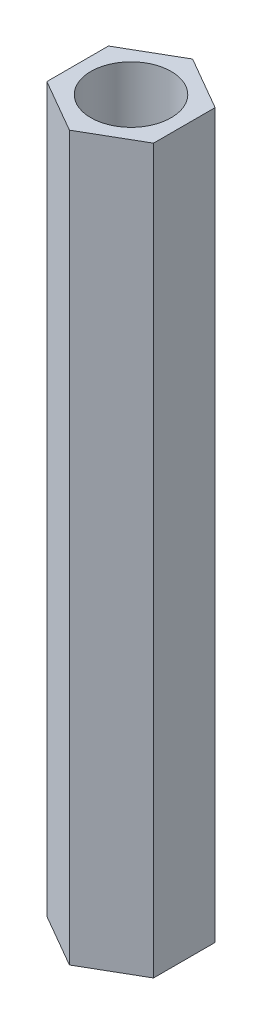
ISO-10303-21;
HEADER;
FILE_DESCRIPTION(('STEP AP214'),'2;1');
FILE_NAME('part.step','',(''),(''),'','','');
FILE_SCHEMA(('AUTOMOTIVE_DESIGN { 1 0 10303 214 1 1 1 1 }'));
ENDSEC;
DATA;
#1=APPLICATION_CONTEXT('core data for automotive mechanical design processes');
#2=APPLICATION_PROTOCOL_DEFINITION('international standard','automotive_design',2000,#1);
#3=PRODUCT_CONTEXT('',#1,'mechanical');
#4=PRODUCT('Part','Part','',(#3));
#5=PRODUCT_RELATED_PRODUCT_CATEGORY('part','',(#4));
#6=PRODUCT_DEFINITION_FORMATION('','',#4);
#7=PRODUCT_DEFINITION_CONTEXT('part definition',#1,'design');
#8=PRODUCT_DEFINITION('design','',#6,#7);
#9=PRODUCT_DEFINITION_SHAPE('','',#8);
#10=(LENGTH_UNIT() NAMED_UNIT(*) SI_UNIT(.MILLI.,.METRE.));
#11=(NAMED_UNIT(*) PLANE_ANGLE_UNIT() SI_UNIT($,.RADIAN.));
#12=(NAMED_UNIT(*) SI_UNIT($,.STERADIAN.) SOLID_ANGLE_UNIT());
#13=UNCERTAINTY_MEASURE_WITH_UNIT(LENGTH_MEASURE(1.E-05),#10,'distance_accuracy_value','');
#14=(GEOMETRIC_REPRESENTATION_CONTEXT(3) GLOBAL_UNCERTAINTY_ASSIGNED_CONTEXT((#13)) GLOBAL_UNIT_ASSIGNED_CONTEXT((#10,
#11,#12)) REPRESENTATION_CONTEXT('',''));
#15=CARTESIAN_POINT('',(0.,0.,0.));
#16=DIRECTION('',(0.,0.,1.));
#17=DIRECTION('',(1.,0.,0.));
#18=AXIS2_PLACEMENT_3D('',#15,#16,#17);
#19=CARTESIAN_POINT('',(0.,27.,0.));
#20=DIRECTION('',(0.,1.,0.));
#21=DIRECTION('',(0.,0.,1.));
#22=AXIS2_PLACEMENT_3D('',#19,#20,#21);
#23=PLANE('',#22);
#24=DIRECTION('',(-0.866025403784439,0.,-0.5));
#25=VECTOR('',#24,1.);
#26=CARTESIAN_POINT('',(1.99185842870421,27.,-1.15));
#27=LINE('',#26,#25);
#28=CARTESIAN_POINT('',(1.99185842870421,27.,-1.15));
#29=VERTEX_POINT('',#28);
#30=CARTESIAN_POINT('',(0.,27.,-2.3));
#31=VERTEX_POINT('',#30);
#32=EDGE_CURVE('E150',#29,#31,#27,.T.);
#33=ORIENTED_EDGE('',*,*,#32,.T.);
#34=DIRECTION('',(-0.866025403784439,0.,0.5));
#35=VECTOR('',#34,1.);
#36=CARTESIAN_POINT('',(0.,27.,-2.3));
#37=LINE('',#36,#35);
#38=CARTESIAN_POINT('',(-1.99185842870421,27.,-1.15));
#39=VERTEX_POINT('',#38);
#40=EDGE_CURVE('E98',#31,#39,#37,.T.);
#41=ORIENTED_EDGE('',*,*,#40,.T.);
#42=DIRECTION('',(0.,0.,1.));
#43=VECTOR('',#42,1.);
#44=CARTESIAN_POINT('',(-1.99185842870421,27.,-1.15));
#45=LINE('',#44,#43);
#46=CARTESIAN_POINT('',(-1.99185842870421,27.,1.15));
#47=VERTEX_POINT('',#46);
#48=EDGE_CURVE('E111',#39,#47,#45,.T.);
#49=ORIENTED_EDGE('',*,*,#48,.T.);
#50=DIRECTION('',(0.866025403784439,0.,0.5));
#51=VECTOR('',#50,1.);
#52=CARTESIAN_POINT('',(-1.99185842870421,27.,1.15));
#53=LINE('',#52,#51);
#54=CARTESIAN_POINT('',(0.,27.,2.3));
#55=VERTEX_POINT('',#54);
#56=EDGE_CURVE('E105',#47,#55,#53,.T.);
#57=ORIENTED_EDGE('',*,*,#56,.T.);
#58=DIRECTION('',(0.866025403784439,0.,-0.5));
#59=VECTOR('',#58,1.);
#60=CARTESIAN_POINT('',(0.,27.,2.3));
#61=LINE('',#60,#59);
#62=CARTESIAN_POINT('',(1.99185842870421,27.,1.15));
#63=VERTEX_POINT('',#62);
#64=EDGE_CURVE('E109',#55,#63,#61,.T.);
#65=ORIENTED_EDGE('',*,*,#64,.T.);
#66=DIRECTION('',(0.,0.,-1.));
#67=VECTOR('',#66,1.);
#68=CARTESIAN_POINT('',(1.99185842870421,27.,1.15));
#69=LINE('',#68,#67);
#70=EDGE_CURVE('E61',#63,#29,#69,.T.);
#71=ORIENTED_EDGE('',*,*,#70,.T.);
#72=EDGE_LOOP('',(#33,#41,#49,#57,#65,#71));
#73=FACE_BOUND('',#72,.T.);
#74=CARTESIAN_POINT('',(0.,27.,0.));
#75=DIRECTION('',(0.,1.,0.));
#76=DIRECTION('',(0.,0.,1.));
#77=AXIS2_PLACEMENT_3D('',#74,#75,#76);
#78=CIRCLE('',#77,1.5);
#79=CARTESIAN_POINT('',(0.,27.,1.5));
#80=VERTEX_POINT('',#79);
#81=EDGE_CURVE('E138',#80,#80,#78,.T.);
#82=ORIENTED_EDGE('',*,*,#81,.F.);
#83=EDGE_LOOP('',(#82));
#84=FACE_BOUND('',#83,.T.);
#85=ADVANCED_FACE('F43',(#73,#84),#23,.T.);
#86=CARTESIAN_POINT('',(0.,0.,0.));
#87=DIRECTION('',(0.,1.,0.));
#88=DIRECTION('',(0.,0.,1.));
#89=AXIS2_PLACEMENT_3D('',#86,#87,#88);
#90=PLANE('',#89);
#91=DIRECTION('',(-0.866025403784439,0.,-0.5));
#92=VECTOR('',#91,1.);
#93=CARTESIAN_POINT('',(1.99185842870421,0.,-1.15));
#94=LINE('',#93,#92);
#95=CARTESIAN_POINT('',(1.99185842870421,0.,-1.15));
#96=VERTEX_POINT('',#95);
#97=CARTESIAN_POINT('',(0.,0.,-2.3));
#98=VERTEX_POINT('',#97);
#99=EDGE_CURVE('E133',#96,#98,#94,.T.);
#100=ORIENTED_EDGE('',*,*,#99,.F.);
#101=DIRECTION('',(0.,0.,-1.));
#102=VECTOR('',#101,1.);
#103=CARTESIAN_POINT('',(1.99185842870421,0.,1.15));
#104=LINE('',#103,#102);
#105=CARTESIAN_POINT('',(1.99185842870421,0.,1.15));
#106=VERTEX_POINT('',#105);
#107=EDGE_CURVE('E90',#106,#96,#104,.T.);
#108=ORIENTED_EDGE('',*,*,#107,.F.);
#109=DIRECTION('',(0.866025403784439,0.,-0.5));
#110=VECTOR('',#109,1.);
#111=CARTESIAN_POINT('',(0.,0.,2.3));
#112=LINE('',#111,#110);
#113=CARTESIAN_POINT('',(0.,0.,2.3));
#114=VERTEX_POINT('',#113);
#115=EDGE_CURVE('E84',#114,#106,#112,.T.);
#116=ORIENTED_EDGE('',*,*,#115,.F.);
#117=DIRECTION('',(0.866025403784439,0.,0.5));
#118=VECTOR('',#117,1.);
#119=CARTESIAN_POINT('',(-1.99185842870421,0.,1.15));
#120=LINE('',#119,#118);
#121=CARTESIAN_POINT('',(-1.99185842870421,0.,1.15));
#122=VERTEX_POINT('',#121);
#123=EDGE_CURVE('E120',#122,#114,#120,.T.);
#124=ORIENTED_EDGE('',*,*,#123,.F.);
#125=DIRECTION('',(0.,0.,1.));
#126=VECTOR('',#125,1.);
#127=CARTESIAN_POINT('',(-1.99185842870421,0.,-1.15));
#128=LINE('',#127,#126);
#129=CARTESIAN_POINT('',(-1.99185842870421,0.,-1.15));
#130=VERTEX_POINT('',#129);
#131=EDGE_CURVE('E141',#130,#122,#128,.T.);
#132=ORIENTED_EDGE('',*,*,#131,.F.);
#133=DIRECTION('',(-0.866025403784439,0.,0.5));
#134=VECTOR('',#133,1.);
#135=CARTESIAN_POINT('',(0.,0.,-2.3));
#136=LINE('',#135,#134);
#137=EDGE_CURVE('E137',#98,#130,#136,.T.);
#138=ORIENTED_EDGE('',*,*,#137,.F.);
#139=EDGE_LOOP('',(#100,#108,#116,#124,#132,#138));
#140=FACE_BOUND('',#139,.T.);
#141=CARTESIAN_POINT('',(0.,0.,0.));
#142=DIRECTION('',(0.,1.,0.));
#143=DIRECTION('',(0.,0.,1.));
#144=AXIS2_PLACEMENT_3D('',#141,#142,#143);
#145=CIRCLE('',#144,1.5);
#146=CARTESIAN_POINT('',(0.,0.,1.5));
#147=VERTEX_POINT('',#146);
#148=EDGE_CURVE('E265',#147,#147,#145,.T.);
#149=ORIENTED_EDGE('',*,*,#148,.T.);
#150=EDGE_LOOP('',(#149));
#151=FACE_BOUND('',#150,.T.);
#152=ADVANCED_FACE('F163',(#140,#151),#90,.F.);
#153=CARTESIAN_POINT('',(1.99185842870421,27.,-1.15));
#154=DIRECTION('',(-0.5,0.,0.866025403784439));
#155=DIRECTION('',(0.866025403784439,0.,0.5));
#156=AXIS2_PLACEMENT_3D('',#153,#154,#155);
#157=PLANE('',#156);
#158=ORIENTED_EDGE('',*,*,#99,.T.);
#159=DIRECTION('',(0.,-1.,0.));
#160=VECTOR('',#159,1.);
#161=CARTESIAN_POINT('',(0.,27.,-2.3));
#162=LINE('',#161,#160);
#163=EDGE_CURVE('E11',#31,#98,#162,.T.);
#164=ORIENTED_EDGE('',*,*,#163,.F.);
#165=ORIENTED_EDGE('',*,*,#32,.F.);
#166=DIRECTION('',(0.,-1.,0.));
#167=VECTOR('',#166,1.);
#168=CARTESIAN_POINT('',(1.99185842870421,27.,-1.15));
#169=LINE('',#168,#167);
#170=EDGE_CURVE('E129',#29,#96,#169,.T.);
#171=ORIENTED_EDGE('',*,*,#170,.T.);
#172=EDGE_LOOP('',(#158,#164,#165,#171));
#173=FACE_BOUND('',#172,.T.);
#174=ADVANCED_FACE('F45',(#173),#157,.F.);
#175=CARTESIAN_POINT('',(0.,27.,-2.3));
#176=DIRECTION('',(0.5,0.,0.866025403784439));
#177=DIRECTION('',(0.866025403784439,0.,-0.5));
#178=AXIS2_PLACEMENT_3D('',#175,#176,#177);
#179=PLANE('',#178);
#180=ORIENTED_EDGE('',*,*,#137,.T.);
#181=DIRECTION('',(0.,-1.,0.));
#182=VECTOR('',#181,1.);
#183=CARTESIAN_POINT('',(-1.99185842870421,27.,-1.15));
#184=LINE('',#183,#182);
#185=EDGE_CURVE('E53',#39,#130,#184,.T.);
#186=ORIENTED_EDGE('',*,*,#185,.F.);
#187=ORIENTED_EDGE('',*,*,#40,.F.);
#188=ORIENTED_EDGE('',*,*,#163,.T.);
#189=EDGE_LOOP('',(#180,#186,#187,#188));
#190=FACE_BOUND('',#189,.T.);
#191=ADVANCED_FACE('F188',(#190),#179,.F.);
#192=CARTESIAN_POINT('',(-1.99185842870421,27.,-1.15));
#193=DIRECTION('',(1.,0.,0.));
#194=DIRECTION('',(0.,0.,-1.));
#195=AXIS2_PLACEMENT_3D('',#192,#193,#194);
#196=PLANE('',#195);
#197=ORIENTED_EDGE('',*,*,#131,.T.);
#198=DIRECTION('',(0.,-1.,0.));
#199=VECTOR('',#198,1.);
#200=CARTESIAN_POINT('',(-1.99185842870421,27.,1.15));
#201=LINE('',#200,#199);
#202=EDGE_CURVE('E122',#47,#122,#201,.T.);
#203=ORIENTED_EDGE('',*,*,#202,.F.);
#204=ORIENTED_EDGE('',*,*,#48,.F.);
#205=ORIENTED_EDGE('',*,*,#185,.T.);
#206=EDGE_LOOP('',(#197,#203,#204,#205));
#207=FACE_BOUND('',#206,.T.);
#208=ADVANCED_FACE('F160',(#207),#196,.F.);
#209=CARTESIAN_POINT('',(-1.99185842870421,27.,1.15));
#210=DIRECTION('',(0.5,0.,-0.866025403784439));
#211=DIRECTION('',(-0.866025403784439,0.,-0.5));
#212=AXIS2_PLACEMENT_3D('',#209,#210,#211);
#213=PLANE('',#212);
#214=ORIENTED_EDGE('',*,*,#123,.T.);
#215=DIRECTION('',(0.,-1.,0.));
#216=VECTOR('',#215,1.);
#217=CARTESIAN_POINT('',(0.,27.,2.3));
#218=LINE('',#217,#216);
#219=EDGE_CURVE('E117',#55,#114,#218,.T.);
#220=ORIENTED_EDGE('',*,*,#219,.F.);
#221=ORIENTED_EDGE('',*,*,#56,.F.);
#222=ORIENTED_EDGE('',*,*,#202,.T.);
#223=EDGE_LOOP('',(#214,#220,#221,#222));
#224=FACE_BOUND('',#223,.T.);
#225=ADVANCED_FACE('F118',(#224),#213,.F.);
#226=CARTESIAN_POINT('',(0.,27.,2.3));
#227=DIRECTION('',(-0.5,0.,-0.866025403784439));
#228=DIRECTION('',(-0.866025403784439,0.,0.5));
#229=AXIS2_PLACEMENT_3D('',#226,#227,#228);
#230=PLANE('',#229);
#231=ORIENTED_EDGE('',*,*,#115,.T.);
#232=DIRECTION('',(0.,-1.,0.));
#233=VECTOR('',#232,1.);
#234=CARTESIAN_POINT('',(1.99185842870421,27.,1.15));
#235=LINE('',#234,#233);
#236=EDGE_CURVE('E123',#63,#106,#235,.T.);
#237=ORIENTED_EDGE('',*,*,#236,.F.);
#238=ORIENTED_EDGE('',*,*,#64,.F.);
#239=ORIENTED_EDGE('',*,*,#219,.T.);
#240=EDGE_LOOP('',(#231,#237,#238,#239));
#241=FACE_BOUND('',#240,.T.);
#242=ADVANCED_FACE('F125',(#241),#230,.F.);
#243=CARTESIAN_POINT('',(1.99185842870421,27.,1.15));
#244=DIRECTION('',(-1.,0.,0.));
#245=DIRECTION('',(0.,0.,1.));
#246=AXIS2_PLACEMENT_3D('',#243,#244,#245);
#247=PLANE('',#246);
#248=ORIENTED_EDGE('',*,*,#107,.T.);
#249=ORIENTED_EDGE('',*,*,#170,.F.);
#250=ORIENTED_EDGE('',*,*,#70,.F.);
#251=ORIENTED_EDGE('',*,*,#236,.T.);
#252=EDGE_LOOP('',(#248,#249,#250,#251));
#253=FACE_BOUND('',#252,.T.);
#254=ADVANCED_FACE('F168',(#253),#247,.F.);
#255=CARTESIAN_POINT('',(0.,27.,0.));
#256=DIRECTION('',(0.,-1.,0.));
#257=DIRECTION('',(0.,0.,-1.));
#258=AXIS2_PLACEMENT_3D('',#255,#256,#257);
#259=CYLINDRICAL_SURFACE('',#258,1.5);
#260=ORIENTED_EDGE('',*,*,#81,.T.);
#261=EDGE_LOOP('',(#260));
#262=FACE_BOUND('',#261,.T.);
#263=ORIENTED_EDGE('',*,*,#148,.F.);
#264=EDGE_LOOP('',(#263));
#265=FACE_BOUND('',#264,.T.);
#266=ADVANCED_FACE('F170',(#262,#265),#259,.F.);
#267=CLOSED_SHELL('',(#85,#152,#174,#191,#208,#225,#242,#254,#266));
#268=MANIFOLD_SOLID_BREP('B2',#267);
#269=ADVANCED_BREP_SHAPE_REPRESENTATION('',(#18,#268),#14);
#270=SHAPE_DEFINITION_REPRESENTATION(#9,#269);
ENDSEC;
END-ISO-10303-21;
